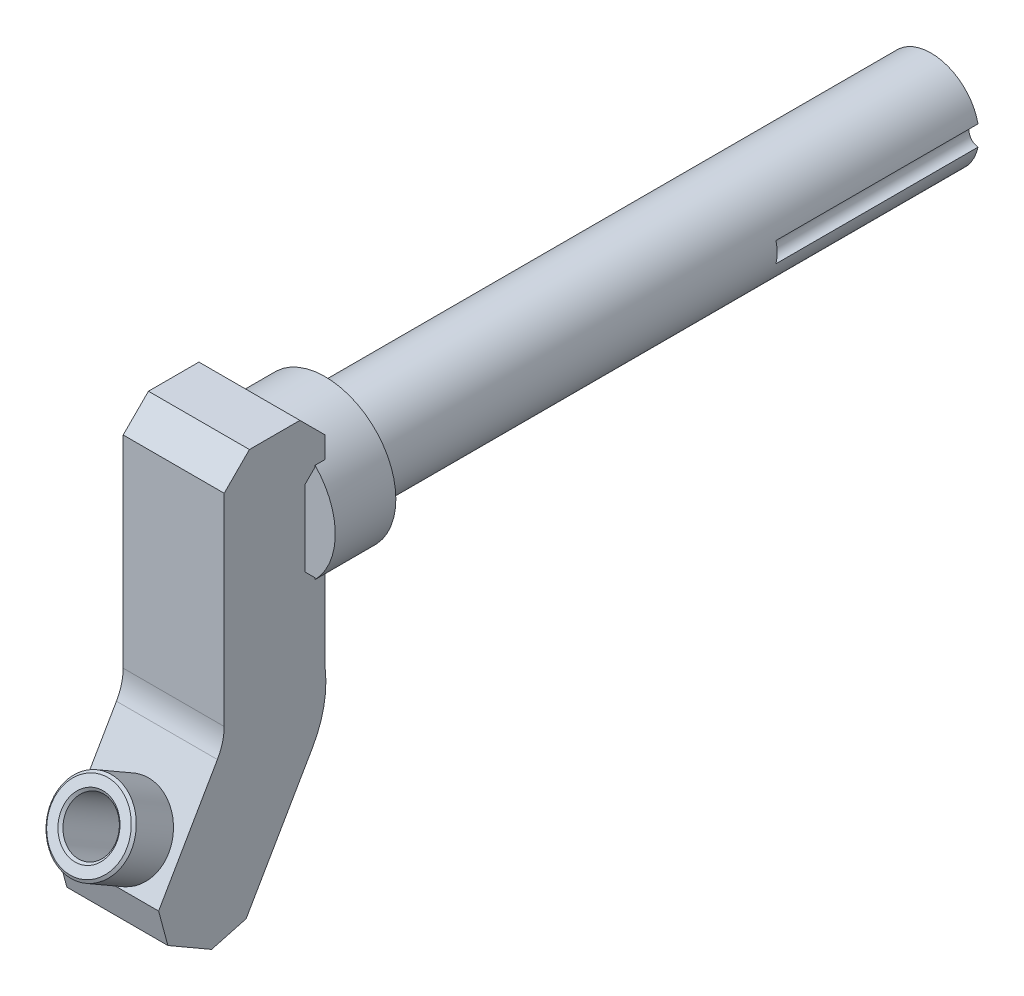
ISO-10303-21;
HEADER;
FILE_DESCRIPTION(('STEP AP214'),'2;1');
FILE_NAME('part.step','',(''),(''),'','','');
FILE_SCHEMA(('AUTOMOTIVE_DESIGN { 1 0 10303 214 1 1 1 1 }'));
ENDSEC;
DATA;
#1=APPLICATION_CONTEXT('core data for automotive mechanical design processes');
#2=APPLICATION_PROTOCOL_DEFINITION('international standard','automotive_design',2000,#1);
#3=PRODUCT_CONTEXT('',#1,'mechanical');
#4=PRODUCT('Part','Part','',(#3));
#5=PRODUCT_RELATED_PRODUCT_CATEGORY('part','',(#4));
#6=PRODUCT_DEFINITION_FORMATION('','',#4);
#7=PRODUCT_DEFINITION_CONTEXT('part definition',#1,'design');
#8=PRODUCT_DEFINITION('design','',#6,#7);
#9=PRODUCT_DEFINITION_SHAPE('','',#8);
#10=(LENGTH_UNIT() NAMED_UNIT(*) SI_UNIT(.MILLI.,.METRE.));
#11=(NAMED_UNIT(*) PLANE_ANGLE_UNIT() SI_UNIT($,.RADIAN.));
#12=(NAMED_UNIT(*) SI_UNIT($,.STERADIAN.) SOLID_ANGLE_UNIT());
#13=UNCERTAINTY_MEASURE_WITH_UNIT(LENGTH_MEASURE(1.E-05),#10,'distance_accuracy_value','');
#14=(GEOMETRIC_REPRESENTATION_CONTEXT(3) GLOBAL_UNCERTAINTY_ASSIGNED_CONTEXT((#13)) GLOBAL_UNIT_ASSIGNED_CONTEXT((#10,
#11,#12)) REPRESENTATION_CONTEXT('',''));
#15=CARTESIAN_POINT('',(0.,0.,0.));
#16=DIRECTION('',(0.,0.,1.));
#17=DIRECTION('',(1.,0.,0.));
#18=AXIS2_PLACEMENT_3D('',#15,#16,#17);
#19=CARTESIAN_POINT('',(10.,19.,130.));
#20=DIRECTION('',(0.,0.,1.));
#21=DIRECTION('',(1.,0.,0.));
#22=AXIS2_PLACEMENT_3D('',#19,#20,#21);
#23=PLANE('',#22);
#24=DIRECTION('',(0.,1.,0.));
#25=VECTOR('',#24,1.);
#26=CARTESIAN_POINT('',(-10.,19.,130.));
#27=LINE('',#26,#25);
#28=CARTESIAN_POINT('',(-10.,9.79795897113271,130.));
#29=VERTEX_POINT('',#28);
#30=CARTESIAN_POINT('',(-10.,14.,130.));
#31=VERTEX_POINT('',#30);
#32=EDGE_CURVE('E265',#29,#31,#27,.T.);
#33=ORIENTED_EDGE('',*,*,#32,.T.);
#34=DIRECTION('',(1.,0.,0.));
#35=VECTOR('',#34,1.);
#36=CARTESIAN_POINT('',(10.,14.,130.));
#37=LINE('',#36,#35);
#38=CARTESIAN_POINT('',(0.,14.,130.));
#39=VERTEX_POINT('',#38);
#40=EDGE_CURVE('E357',#31,#39,#37,.T.);
#41=ORIENTED_EDGE('',*,*,#40,.T.);
#42=CARTESIAN_POINT('',(0.,0.,130.));
#43=DIRECTION('',(0.,0.,1.));
#44=DIRECTION('',(1.,0.,0.));
#45=AXIS2_PLACEMENT_3D('',#42,#43,#44);
#46=CIRCLE('',#45,14.);
#47=EDGE_CURVE('E319',#39,#29,#46,.T.);
#48=ORIENTED_EDGE('',*,*,#47,.T.);
#49=EDGE_LOOP('',(#33,#41,#48));
#50=FACE_BOUND('',#49,.T.);
#51=ADVANCED_FACE('F42',(#50),#23,.F.);
#52=CARTESIAN_POINT('',(0.,0.,120.));
#53=DIRECTION('',(0.,0.,-1.));
#54=DIRECTION('',(-1.,0.,0.));
#55=AXIS2_PLACEMENT_3D('',#52,#53,#54);
#56=CYLINDRICAL_SURFACE('',#55,9.5);
#57=CARTESIAN_POINT('',(0.,0.,0.));
#58=DIRECTION('',(0.,0.,1.));
#59=DIRECTION('',(1.,0.,0.));
#60=AXIS2_PLACEMENT_3D('',#57,#58,#59);
#61=CIRCLE('',#60,9.5);
#62=CARTESIAN_POINT('',(9.28947368421052,1.98888880291486,0.));
#63=VERTEX_POINT('',#62);
#64=CARTESIAN_POINT('',(9.28947368421052,-1.98888880291486,0.));
#65=VERTEX_POINT('',#64);
#66=EDGE_CURVE('E214',#63,#65,#61,.T.);
#67=ORIENTED_EDGE('',*,*,#66,.T.);
#68=DIRECTION('',(0.,0.,-1.));
#69=VECTOR('',#68,1.);
#70=CARTESIAN_POINT('',(9.28947368421053,-1.98888880291486,40.));
#71=LINE('',#70,#69);
#72=CARTESIAN_POINT('',(9.28947368421053,-1.98888880291486,40.));
#73=VERTEX_POINT('',#72);
#74=EDGE_CURVE('E58',#73,#65,#71,.T.);
#75=ORIENTED_EDGE('',*,*,#74,.F.);
#76=CARTESIAN_POINT('',(0.,0.,40.));
#77=DIRECTION('',(0.,0.,-1.));
#78=DIRECTION('',(-1.,0.,0.));
#79=AXIS2_PLACEMENT_3D('',#76,#77,#78);
#80=CIRCLE('',#79,9.5);
#81=CARTESIAN_POINT('',(9.28947368421052,1.98888880291486,40.));
#82=VERTEX_POINT('',#81);
#83=EDGE_CURVE('E200',#82,#73,#80,.T.);
#84=ORIENTED_EDGE('',*,*,#83,.F.);
#85=DIRECTION('',(0.,0.,-1.));
#86=VECTOR('',#85,1.);
#87=CARTESIAN_POINT('',(9.28947368421052,1.98888880291486,40.));
#88=LINE('',#87,#86);
#89=EDGE_CURVE('E208',#82,#63,#88,.T.);
#90=ORIENTED_EDGE('',*,*,#89,.T.);
#91=EDGE_LOOP('',(#67,#75,#84,#90));
#92=FACE_BOUND('',#91,.T.);
#93=CARTESIAN_POINT('',(0.,0.,120.));
#94=DIRECTION('',(0.,0.,1.));
#95=DIRECTION('',(1.,0.,0.));
#96=AXIS2_PLACEMENT_3D('',#93,#94,#95);
#97=CIRCLE('',#96,9.5);
#98=CARTESIAN_POINT('',(9.5,0.,120.));
#99=VERTEX_POINT('',#98);
#100=EDGE_CURVE('E298',#99,#99,#97,.T.);
#101=ORIENTED_EDGE('',*,*,#100,.F.);
#102=EDGE_LOOP('',(#101));
#103=FACE_BOUND('',#102,.T.);
#104=ADVANCED_FACE('F211',(#92,#103),#56,.T.);
#105=CARTESIAN_POINT('',(0.,0.,0.));
#106=DIRECTION('',(0.,0.,1.));
#107=DIRECTION('',(1.,0.,0.));
#108=AXIS2_PLACEMENT_3D('',#105,#106,#107);
#109=PLANE('',#108);
#110=ORIENTED_EDGE('',*,*,#66,.F.);
#111=CARTESIAN_POINT('',(9.5,0.,0.));
#112=DIRECTION('',(0.,0.,-1.));
#113=DIRECTION('',(-1.,0.,0.));
#114=AXIS2_PLACEMENT_3D('',#111,#112,#113);
#115=CIRCLE('',#114,2.);
#116=EDGE_CURVE('E205',#65,#63,#115,.T.);
#117=ORIENTED_EDGE('',*,*,#116,.F.);
#118=EDGE_LOOP('',(#110,#117));
#119=FACE_BOUND('',#118,.T.);
#120=ADVANCED_FACE('F504',(#119),#109,.F.);
#121=CARTESIAN_POINT('',(0.,0.,132.));
#122=DIRECTION('',(0.,0.,-1.));
#123=DIRECTION('',(-1.,0.,0.));
#124=AXIS2_PLACEMENT_3D('',#121,#122,#123);
#125=CYLINDRICAL_SURFACE('',#124,14.);
#126=CARTESIAN_POINT('',(0.,0.,132.));
#127=DIRECTION('',(0.,0.,1.));
#128=DIRECTION('',(1.,0.,0.));
#129=AXIS2_PLACEMENT_3D('',#126,#127,#128);
#130=CIRCLE('',#129,14.);
#131=CARTESIAN_POINT('',(10.,-9.79795897113271,132.));
#132=VERTEX_POINT('',#131);
#133=CARTESIAN_POINT('',(10.,9.79795897113271,132.));
#134=VERTEX_POINT('',#133);
#135=EDGE_CURVE('E292',#132,#134,#130,.T.);
#136=ORIENTED_EDGE('',*,*,#135,.F.);
#137=DIRECTION('',(0.,0.,-1.));
#138=VECTOR('',#137,1.);
#139=CARTESIAN_POINT('',(10.,-9.79795897113271,132.));
#140=LINE('',#139,#138);
#141=CARTESIAN_POINT('',(10.,-9.79795897113271,130.));
#142=VERTEX_POINT('',#141);
#143=EDGE_CURVE('E288',#132,#142,#140,.T.);
#144=ORIENTED_EDGE('',*,*,#143,.T.);
#145=CARTESIAN_POINT('',(0.,0.,130.));
#146=DIRECTION('',(0.,0.,1.));
#147=DIRECTION('',(1.,0.,0.));
#148=AXIS2_PLACEMENT_3D('',#145,#146,#147);
#149=CIRCLE('',#148,14.);
#150=CARTESIAN_POINT('',(-10.,-9.79795897113271,130.));
#151=VERTEX_POINT('',#150);
#152=EDGE_CURVE('E318',#151,#142,#149,.T.);
#153=ORIENTED_EDGE('',*,*,#152,.F.);
#154=DIRECTION('',(0.,0.,-1.));
#155=VECTOR('',#154,1.);
#156=CARTESIAN_POINT('',(-10.,-9.79795897113271,132.));
#157=LINE('',#156,#155);
#158=CARTESIAN_POINT('',(-10.,-9.79795897113271,132.));
#159=VERTEX_POINT('',#158);
#160=EDGE_CURVE('E283',#159,#151,#157,.T.);
#161=ORIENTED_EDGE('',*,*,#160,.F.);
#162=CARTESIAN_POINT('',(-10.,9.79795897113271,132.));
#163=VERTEX_POINT('',#162);
#164=EDGE_CURVE('E295',#163,#159,#130,.T.);
#165=ORIENTED_EDGE('',*,*,#164,.F.);
#166=DIRECTION('',(0.,0.,-1.));
#167=VECTOR('',#166,1.);
#168=CARTESIAN_POINT('',(-10.,9.79795897113271,132.));
#169=LINE('',#168,#167);
#170=EDGE_CURVE('E281',#29,#163,#169,.F.);
#171=ORIENTED_EDGE('',*,*,#170,.F.);
#172=ORIENTED_EDGE('',*,*,#47,.F.);
#173=CARTESIAN_POINT('',(10.,9.79795897113271,130.));
#174=VERTEX_POINT('',#173);
#175=EDGE_CURVE('E315',#174,#39,#46,.T.);
#176=ORIENTED_EDGE('',*,*,#175,.F.);
#177=DIRECTION('',(0.,0.,-1.));
#178=VECTOR('',#177,1.);
#179=CARTESIAN_POINT('',(10.,9.79795897113271,132.));
#180=LINE('',#179,#178);
#181=EDGE_CURVE('E285',#174,#134,#180,.F.);
#182=ORIENTED_EDGE('',*,*,#181,.T.);
#183=EDGE_LOOP('',(#136,#144,#153,#161,#165,#171,#172,#176,#182));
#184=FACE_BOUND('',#183,.T.);
#185=CARTESIAN_POINT('',(0.,0.,120.));
#186=DIRECTION('',(0.,0.,1.));
#187=DIRECTION('',(1.,0.,0.));
#188=AXIS2_PLACEMENT_3D('',#185,#186,#187);
#189=CIRCLE('',#188,14.);
#190=CARTESIAN_POINT('',(14.,0.,120.));
#191=VERTEX_POINT('',#190);
#192=EDGE_CURVE('E291',#191,#191,#189,.T.);
#193=ORIENTED_EDGE('',*,*,#192,.T.);
#194=EDGE_LOOP('',(#193));
#195=FACE_BOUND('',#194,.T.);
#196=ADVANCED_FACE('F407',(#184,#195),#125,.T.);
#197=CARTESIAN_POINT('',(0.,0.,132.));
#198=DIRECTION('',(0.,0.,1.));
#199=DIRECTION('',(1.,0.,0.));
#200=AXIS2_PLACEMENT_3D('',#197,#198,#199);
#201=PLANE('',#200);
#202=DIRECTION('',(0.,1.,0.));
#203=VECTOR('',#202,1.);
#204=CARTESIAN_POINT('',(10.,0.,132.));
#205=LINE('',#204,#203);
#206=CARTESIAN_POINT('',(10.,-9.5,132.));
#207=VERTEX_POINT('',#206);
#208=EDGE_CURVE('E311',#132,#207,#205,.T.);
#209=ORIENTED_EDGE('',*,*,#208,.F.);
#210=ORIENTED_EDGE('',*,*,#135,.T.);
#211=CARTESIAN_POINT('',(10.,9.5,132.));
#212=VERTEX_POINT('',#211);
#213=EDGE_CURVE('E309',#212,#134,#205,.T.);
#214=ORIENTED_EDGE('',*,*,#213,.F.);
#215=DIRECTION('',(-1.,0.,0.));
#216=VECTOR('',#215,1.);
#217=CARTESIAN_POINT('',(0.,9.5,132.));
#218=LINE('',#217,#216);
#219=CARTESIAN_POINT('',(-10.,9.5,132.));
#220=VERTEX_POINT('',#219);
#221=EDGE_CURVE('E305',#212,#220,#218,.T.);
#222=ORIENTED_EDGE('',*,*,#221,.T.);
#223=DIRECTION('',(0.,1.,0.));
#224=VECTOR('',#223,1.);
#225=CARTESIAN_POINT('',(-10.,0.,132.));
#226=LINE('',#225,#224);
#227=EDGE_CURVE('E301',#220,#163,#226,.T.);
#228=ORIENTED_EDGE('',*,*,#227,.T.);
#229=ORIENTED_EDGE('',*,*,#164,.T.);
#230=CARTESIAN_POINT('',(-10.,-9.5,132.));
#231=VERTEX_POINT('',#230);
#232=EDGE_CURVE('E306',#159,#231,#226,.T.);
#233=ORIENTED_EDGE('',*,*,#232,.T.);
#234=DIRECTION('',(1.,0.,0.));
#235=VECTOR('',#234,1.);
#236=CARTESIAN_POINT('',(0.,-9.5,132.));
#237=LINE('',#236,#235);
#238=EDGE_CURVE('E312',#231,#207,#237,.T.);
#239=ORIENTED_EDGE('',*,*,#238,.T.);
#240=EDGE_LOOP('',(#209,#210,#214,#222,#228,#229,#233,#239));
#241=FACE_BOUND('',#240,.T.);
#242=ADVANCED_FACE('F404',(#241),#201,.T.);
#243=CARTESIAN_POINT('',(0.,0.,120.));
#244=DIRECTION('',(0.,0.,1.));
#245=DIRECTION('',(1.,0.,0.));
#246=AXIS2_PLACEMENT_3D('',#243,#244,#245);
#247=PLANE('',#246);
#248=ORIENTED_EDGE('',*,*,#100,.T.);
#249=EDGE_LOOP('',(#248));
#250=FACE_BOUND('',#249,.T.);
#251=ORIENTED_EDGE('',*,*,#192,.F.);
#252=EDGE_LOOP('',(#251));
#253=FACE_BOUND('',#252,.T.);
#254=ADVANCED_FACE('F531',(#250,#253),#247,.F.);
#255=CARTESIAN_POINT('',(10.,-26.,160.));
#256=DIRECTION('',(1.,0.,0.));
#257=DIRECTION('',(0.,0.,-1.));
#258=AXIS2_PLACEMENT_3D('',#255,#256,#257);
#259=PLANE('',#258);
#260=DIRECTION('',(0.,1.,0.));
#261=VECTOR('',#260,1.);
#262=CARTESIAN_POINT('',(10.,19.,130.));
#263=LINE('',#262,#261);
#264=CARTESIAN_POINT('',(10.,14.,130.));
#265=VERTEX_POINT('',#264);
#266=EDGE_CURVE('E240',#174,#265,#263,.T.);
#267=ORIENTED_EDGE('',*,*,#266,.T.);
#268=DIRECTION('',(0.,-0.707106781186549,-0.707106781186546));
#269=VECTOR('',#268,1.);
#270=CARTESIAN_POINT('',(10.,8.99999999999989,125.));
#271=LINE('',#270,#269);
#272=CARTESIAN_POINT('',(10.,19.,135.));
#273=VERTEX_POINT('',#272);
#274=EDGE_CURVE('E365',#265,#273,#271,.F.);
#275=ORIENTED_EDGE('',*,*,#274,.T.);
#276=DIRECTION('',(0.,0.,1.));
#277=VECTOR('',#276,1.);
#278=CARTESIAN_POINT('',(10.,19.,150.));
#279=LINE('',#278,#277);
#280=CARTESIAN_POINT('',(10.,19.,145.));
#281=VERTEX_POINT('',#280);
#282=EDGE_CURVE('E243',#273,#281,#279,.T.);
#283=ORIENTED_EDGE('',*,*,#282,.T.);
#284=DIRECTION('',(0.,0.707106781186546,-0.707106781186549));
#285=VECTOR('',#284,1.);
#286=CARTESIAN_POINT('',(10.,-10.9999999999999,175.));
#287=LINE('',#286,#285);
#288=CARTESIAN_POINT('',(10.,14.,150.));
#289=VERTEX_POINT('',#288);
#290=EDGE_CURVE('E363',#281,#289,#287,.F.);
#291=ORIENTED_EDGE('',*,*,#290,.T.);
#292=DIRECTION('',(0.,-1.,0.));
#293=VECTOR('',#292,1.);
#294=CARTESIAN_POINT('',(10.,19.,150.));
#295=LINE('',#294,#293);
#296=CARTESIAN_POINT('',(10.,-26.,150.));
#297=VERTEX_POINT('',#296);
#298=EDGE_CURVE('E220',#289,#297,#295,.T.);
#299=ORIENTED_EDGE('',*,*,#298,.T.);
#300=CARTESIAN_POINT('',(10.,-26.,160.));
#301=DIRECTION('',(-1.,0.,0.));
#302=DIRECTION('',(0.,0.,-1.));
#303=AXIS2_PLACEMENT_3D('',#300,#301,#302);
#304=CIRCLE('',#303,10.);
#305=CARTESIAN_POINT('',(10.,-31.,151.339745962156));
#306=VERTEX_POINT('',#305);
#307=EDGE_CURVE('E222',#297,#306,#304,.T.);
#308=ORIENTED_EDGE('',*,*,#307,.T.);
#309=DIRECTION('',(0.,-0.866025403784442,0.499999999999995));
#310=VECTOR('',#309,1.);
#311=CARTESIAN_POINT('',(10.,-55.4940905122491,165.481415712957));
#312=LINE('',#311,#310);
#313=CARTESIAN_POINT('',(10.,-51.1639634933269,162.981415712958));
#314=VERTEX_POINT('',#313);
#315=EDGE_CURVE('E225',#306,#314,#312,.T.);
#316=ORIENTED_EDGE('',*,*,#315,.T.);
#317=DIRECTION('',(0.,0.965925826289066,0.258819045102529));
#318=VECTOR('',#317,1.);
#319=CARTESIAN_POINT('',(10.,-28.4310198523403,169.072689603142));
#320=LINE('',#319,#318);
#321=CARTESIAN_POINT('',(10.,-57.994090512249,161.151288694035));
#322=VERTEX_POINT('',#321);
#323=EDGE_CURVE('E359',#314,#322,#320,.F.);
#324=ORIENTED_EDGE('',*,*,#323,.T.);
#325=DIRECTION('',(0.,-0.499999999999994,-0.866025403784442));
#326=VECTOR('',#325,1.);
#327=CARTESIAN_POINT('',(10.,-55.4940905122491,165.481415712957));
#328=LINE('',#327,#326);
#329=CARTESIAN_POINT('',(10.,-62.994090512249,152.491034656191));
#330=VERTEX_POINT('',#329);
#331=EDGE_CURVE('E228',#322,#330,#328,.T.);
#332=ORIENTED_EDGE('',*,*,#331,.T.);
#333=DIRECTION('',(0.,-0.258819045102525,0.965925826289067));
#334=VECTOR('',#333,1.);
#335=CARTESIAN_POINT('',(10.,-62.3931976788309,150.248472071971));
#336=LINE('',#335,#334);
#337=CARTESIAN_POINT('',(10.,-61.1639634933267,145.660907637269));
#338=VERTEX_POINT('',#337);
#339=EDGE_CURVE('E361',#330,#338,#336,.F.);
#340=ORIENTED_EDGE('',*,*,#339,.T.);
#341=DIRECTION('',(0.,0.866025403784442,-0.499999999999994));
#342=VECTOR('',#341,1.);
#343=CARTESIAN_POINT('',(10.,-65.494090512249,148.160907637269));
#344=LINE('',#343,#342);
#345=CARTESIAN_POINT('',(10.,-38.4241007691811,132.532041772148));
#346=VERTEX_POINT('',#345);
#347=EDGE_CURVE('E231',#338,#346,#344,.T.);
#348=ORIENTED_EDGE('',*,*,#347,.T.);
#349=CARTESIAN_POINT('',(10.,-28.4241007691812,149.852549847837));
#350=DIRECTION('',(1.,0.,0.));
#351=DIRECTION('',(0.,0.,-1.));
#352=AXIS2_PLACEMENT_3D('',#349,#350,#351);
#353=CIRCLE('',#352,20.);
#354=CARTESIAN_POINT('',(10.,-26.,130.));
#355=VERTEX_POINT('',#354);
#356=EDGE_CURVE('E233',#346,#355,#353,.T.);
#357=ORIENTED_EDGE('',*,*,#356,.T.);
#358=DIRECTION('',(0.,1.,0.));
#359=VECTOR('',#358,1.);
#360=CARTESIAN_POINT('',(10.,-9.5,130.));
#361=LINE('',#360,#359);
#362=EDGE_CURVE('E235',#355,#142,#361,.T.);
#363=ORIENTED_EDGE('',*,*,#362,.T.);
#364=ORIENTED_EDGE('',*,*,#143,.F.);
#365=ORIENTED_EDGE('',*,*,#208,.T.);
#366=DIRECTION('',(0.,-0.707106781186547,-0.707106781186548));
#367=VECTOR('',#366,1.);
#368=CARTESIAN_POINT('',(10.,-7.5,134.));
#369=LINE('',#368,#367);
#370=CARTESIAN_POINT('',(10.,-7.5,134.));
#371=VERTEX_POINT('',#370);
#372=EDGE_CURVE('E388',#207,#371,#369,.F.);
#373=ORIENTED_EDGE('',*,*,#372,.T.);
#374=DIRECTION('',(0.,1.,0.));
#375=VECTOR('',#374,1.);
#376=CARTESIAN_POINT('',(10.,9.5,134.));
#377=LINE('',#376,#375);
#378=CARTESIAN_POINT('',(10.,7.49999999999997,134.));
#379=VERTEX_POINT('',#378);
#380=EDGE_CURVE('E238',#371,#379,#377,.T.);
#381=ORIENTED_EDGE('',*,*,#380,.T.);
#382=DIRECTION('',(0.,-0.707106781186548,0.707106781186548));
#383=VECTOR('',#382,1.);
#384=CARTESIAN_POINT('',(10.,9.5,132.));
#385=LINE('',#384,#383);
#386=EDGE_CURVE('E11',#379,#212,#385,.F.);
#387=ORIENTED_EDGE('',*,*,#386,.T.);
#388=ORIENTED_EDGE('',*,*,#213,.T.);
#389=ORIENTED_EDGE('',*,*,#181,.F.);
#390=EDGE_LOOP('',(#267,#275,#283,#291,#299,#308,#316,#324,#332,#340,#348,#357,#363,#364,#365,
#373,#381,#387,#388,#389));
#391=FACE_BOUND('',#390,.T.);
#392=ADVANCED_FACE('F401',(#391),#259,.T.);
#393=CARTESIAN_POINT('',(-10.,-26.,160.));
#394=DIRECTION('',(1.,0.,0.));
#395=DIRECTION('',(0.,0.,-1.));
#396=AXIS2_PLACEMENT_3D('',#393,#394,#395);
#397=PLANE('',#396);
#398=DIRECTION('',(0.,0.,1.));
#399=VECTOR('',#398,1.);
#400=CARTESIAN_POINT('',(-10.,19.,150.));
#401=LINE('',#400,#399);
#402=CARTESIAN_POINT('',(-10.,19.,135.));
#403=VERTEX_POINT('',#402);
#404=CARTESIAN_POINT('',(-10.,19.,145.));
#405=VERTEX_POINT('',#404);
#406=EDGE_CURVE('E223',#403,#405,#401,.T.);
#407=ORIENTED_EDGE('',*,*,#406,.F.);
#408=DIRECTION('',(0.,0.707106781186549,0.707106781186546));
#409=VECTOR('',#408,1.);
#410=CARTESIAN_POINT('',(-10.,19.,135.));
#411=LINE('',#410,#409);
#412=EDGE_CURVE('E353',#403,#31,#411,.F.);
#413=ORIENTED_EDGE('',*,*,#412,.T.);
#414=ORIENTED_EDGE('',*,*,#32,.F.);
#415=ORIENTED_EDGE('',*,*,#170,.T.);
#416=ORIENTED_EDGE('',*,*,#227,.F.);
#417=DIRECTION('',(0.,0.707106781186548,-0.707106781186548));
#418=VECTOR('',#417,1.);
#419=CARTESIAN_POINT('',(-10.,-22.25,163.75));
#420=LINE('',#419,#418);
#421=CARTESIAN_POINT('',(-10.,7.49999999999997,134.));
#422=VERTEX_POINT('',#421);
#423=EDGE_CURVE('E51',#220,#422,#420,.F.);
#424=ORIENTED_EDGE('',*,*,#423,.T.);
#425=DIRECTION('',(0.,1.,0.));
#426=VECTOR('',#425,1.);
#427=CARTESIAN_POINT('',(-10.,9.5,134.));
#428=LINE('',#427,#426);
#429=CARTESIAN_POINT('',(-10.,-7.5,134.));
#430=VERTEX_POINT('',#429);
#431=EDGE_CURVE('E263',#430,#422,#428,.T.);
#432=ORIENTED_EDGE('',*,*,#431,.F.);
#433=DIRECTION('',(0.,0.707106781186547,0.707106781186548));
#434=VECTOR('',#433,1.);
#435=CARTESIAN_POINT('',(-10.,-3.74999999999998,137.75));
#436=LINE('',#435,#434);
#437=EDGE_CURVE('E386',#430,#231,#436,.F.);
#438=ORIENTED_EDGE('',*,*,#437,.T.);
#439=ORIENTED_EDGE('',*,*,#232,.F.);
#440=ORIENTED_EDGE('',*,*,#160,.T.);
#441=DIRECTION('',(0.,1.,0.));
#442=VECTOR('',#441,1.);
#443=CARTESIAN_POINT('',(-10.,-9.5,130.));
#444=LINE('',#443,#442);
#445=CARTESIAN_POINT('',(-10.,-26.,130.));
#446=VERTEX_POINT('',#445);
#447=EDGE_CURVE('E260',#446,#151,#444,.T.);
#448=ORIENTED_EDGE('',*,*,#447,.F.);
#449=CARTESIAN_POINT('',(-10.,-28.4241007691812,149.852549847837));
#450=DIRECTION('',(1.,0.,0.));
#451=DIRECTION('',(0.,0.,-1.));
#452=AXIS2_PLACEMENT_3D('',#449,#450,#451);
#453=CIRCLE('',#452,20.);
#454=CARTESIAN_POINT('',(-10.,-38.4241007691811,132.532041772148));
#455=VERTEX_POINT('',#454);
#456=EDGE_CURVE('E258',#455,#446,#453,.T.);
#457=ORIENTED_EDGE('',*,*,#456,.F.);
#458=DIRECTION('',(0.,0.866025403784442,-0.499999999999994));
#459=VECTOR('',#458,1.);
#460=CARTESIAN_POINT('',(-10.,-65.494090512249,148.160907637269));
#461=LINE('',#460,#459);
#462=CARTESIAN_POINT('',(-10.,-61.1639634933267,145.660907637269));
#463=VERTEX_POINT('',#462);
#464=EDGE_CURVE('E256',#463,#455,#461,.T.);
#465=ORIENTED_EDGE('',*,*,#464,.F.);
#466=DIRECTION('',(0.,0.258819045102525,-0.965925826289067));
#467=VECTOR('',#466,1.);
#468=CARTESIAN_POINT('',(-10.,-61.1639634933267,145.660907637269));
#469=LINE('',#468,#467);
#470=CARTESIAN_POINT('',(-10.,-62.994090512249,152.491034656191));
#471=VERTEX_POINT('',#470);
#472=EDGE_CURVE('E349',#463,#471,#469,.F.);
#473=ORIENTED_EDGE('',*,*,#472,.T.);
#474=DIRECTION('',(0.,-0.499999999999994,-0.866025403784442));
#475=VECTOR('',#474,1.);
#476=CARTESIAN_POINT('',(-10.,-55.4940905122491,165.481415712957));
#477=LINE('',#476,#475);
#478=CARTESIAN_POINT('',(-10.,-57.994090512249,161.151288694035));
#479=VERTEX_POINT('',#478);
#480=EDGE_CURVE('E253',#479,#471,#477,.T.);
#481=ORIENTED_EDGE('',*,*,#480,.F.);
#482=DIRECTION('',(0.,-0.965925826289066,-0.258819045102529));
#483=VECTOR('',#482,1.);
#484=CARTESIAN_POINT('',(-10.,-57.994090512249,161.151288694035));
#485=LINE('',#484,#483);
#486=CARTESIAN_POINT('',(-10.,-51.1639634933269,162.981415712958));
#487=VERTEX_POINT('',#486);
#488=EDGE_CURVE('E347',#479,#487,#485,.F.);
#489=ORIENTED_EDGE('',*,*,#488,.T.);
#490=DIRECTION('',(0.,-0.866025403784442,0.499999999999995));
#491=VECTOR('',#490,1.);
#492=CARTESIAN_POINT('',(-10.,-55.4940905122491,165.481415712957));
#493=LINE('',#492,#491);
#494=CARTESIAN_POINT('',(-10.,-31.,151.339745962156));
#495=VERTEX_POINT('',#494);
#496=EDGE_CURVE('E250',#495,#487,#493,.T.);
#497=ORIENTED_EDGE('',*,*,#496,.F.);
#498=CARTESIAN_POINT('',(-10.,-26.,160.));
#499=DIRECTION('',(-1.,0.,0.));
#500=DIRECTION('',(0.,0.,-1.));
#501=AXIS2_PLACEMENT_3D('',#498,#499,#500);
#502=CIRCLE('',#501,10.);
#503=CARTESIAN_POINT('',(-10.,-26.,150.));
#504=VERTEX_POINT('',#503);
#505=EDGE_CURVE('E248',#504,#495,#502,.T.);
#506=ORIENTED_EDGE('',*,*,#505,.F.);
#507=DIRECTION('',(0.,-1.,0.));
#508=VECTOR('',#507,1.);
#509=CARTESIAN_POINT('',(-10.,19.,150.));
#510=LINE('',#509,#508);
#511=CARTESIAN_POINT('',(-10.,14.,150.));
#512=VERTEX_POINT('',#511);
#513=EDGE_CURVE('E216',#512,#504,#510,.T.);
#514=ORIENTED_EDGE('',*,*,#513,.F.);
#515=DIRECTION('',(0.,-0.707106781186546,0.707106781186549));
#516=VECTOR('',#515,1.);
#517=CARTESIAN_POINT('',(-10.,14.,150.));
#518=LINE('',#517,#516);
#519=EDGE_CURVE('E351',#512,#405,#518,.F.);
#520=ORIENTED_EDGE('',*,*,#519,.T.);
#521=EDGE_LOOP('',(#407,#413,#414,#415,#416,#424,#432,#438,#439,#440,#448,#457,#465,#473,#481,
#489,#497,#506,#514,#520));
#522=FACE_BOUND('',#521,.T.);
#523=ADVANCED_FACE('F393',(#522),#397,.F.);
#524=CARTESIAN_POINT('',(10.,19.,150.));
#525=DIRECTION('',(0.,0.,-1.));
#526=DIRECTION('',(-1.,0.,0.));
#527=AXIS2_PLACEMENT_3D('',#524,#525,#526);
#528=PLANE('',#527);
#529=ORIENTED_EDGE('',*,*,#298,.F.);
#530=DIRECTION('',(-1.,0.,0.));
#531=VECTOR('',#530,1.);
#532=CARTESIAN_POINT('',(10.,14.,150.));
#533=LINE('',#532,#531);
#534=EDGE_CURVE('E367',#289,#512,#533,.T.);
#535=ORIENTED_EDGE('',*,*,#534,.T.);
#536=ORIENTED_EDGE('',*,*,#513,.T.);
#537=DIRECTION('',(-1.,0.,0.));
#538=VECTOR('',#537,1.);
#539=CARTESIAN_POINT('',(10.,-26.,150.));
#540=LINE('',#539,#538);
#541=EDGE_CURVE('E278',#297,#504,#540,.T.);
#542=ORIENTED_EDGE('',*,*,#541,.F.);
#543=EDGE_LOOP('',(#529,#535,#536,#542));
#544=FACE_BOUND('',#543,.T.);
#545=ADVANCED_FACE('F433',(#544),#528,.F.);
#546=CARTESIAN_POINT('',(10.,-26.,160.));
#547=DIRECTION('',(-1.,0.,0.));
#548=DIRECTION('',(0.,0.,1.));
#549=AXIS2_PLACEMENT_3D('',#546,#547,#548);
#550=CYLINDRICAL_SURFACE('',#549,10.);
#551=ORIENTED_EDGE('',*,*,#505,.T.);
#552=DIRECTION('',(-1.,0.,0.));
#553=VECTOR('',#552,1.);
#554=CARTESIAN_POINT('',(10.,-31.,151.339745962156));
#555=LINE('',#554,#553);
#556=EDGE_CURVE('E275',#306,#495,#555,.T.);
#557=ORIENTED_EDGE('',*,*,#556,.F.);
#558=ORIENTED_EDGE('',*,*,#307,.F.);
#559=ORIENTED_EDGE('',*,*,#541,.T.);
#560=EDGE_LOOP('',(#551,#557,#558,#559));
#561=FACE_BOUND('',#560,.T.);
#562=ADVANCED_FACE('F437',(#561),#550,.F.);
#563=CARTESIAN_POINT('',(10.,-55.4940905122491,165.481415712957));
#564=DIRECTION('',(0.,-0.499999999999995,-0.866025403784442));
#565=DIRECTION('',(0.,0.866025403784442,-0.499999999999995));
#566=AXIS2_PLACEMENT_3D('',#563,#564,#565);
#567=PLANE('',#566);
#568=ORIENTED_EDGE('',*,*,#496,.T.);
#569=DIRECTION('',(1.,0.,0.));
#570=VECTOR('',#569,1.);
#571=CARTESIAN_POINT('',(10.,-51.1639634933269,162.981415712958));
#572=LINE('',#571,#570);
#573=CARTESIAN_POINT('',(0.,-51.1639634933269,162.981415712958));
#574=VERTEX_POINT('',#573);
#575=EDGE_CURVE('E380',#487,#574,#572,.T.);
#576=ORIENTED_EDGE('',*,*,#575,.T.);
#577=CARTESIAN_POINT('',(0.,-44.2357602630514,158.981415712958));
#578=DIRECTION('',(0.,-0.499999999999995,-0.866025403784442));
#579=DIRECTION('',(0.,0.866025403784442,-0.499999999999995));
#580=AXIS2_PLACEMENT_3D('',#577,#578,#579);
#581=CIRCLE('',#580,8.00000000000001);
#582=EDGE_CURVE('E321',#574,#574,#581,.F.);
#583=ORIENTED_EDGE('',*,*,#582,.F.);
#584=DIRECTION('',(1.,0.,0.));
#585=VECTOR('',#584,1.);
#586=CARTESIAN_POINT('',(10.,-51.1639634933269,162.981415712958));
#587=LINE('',#586,#585);
#588=EDGE_CURVE('E378',#574,#314,#587,.T.);
#589=ORIENTED_EDGE('',*,*,#588,.T.);
#590=ORIENTED_EDGE('',*,*,#315,.F.);
#591=ORIENTED_EDGE('',*,*,#556,.T.);
#592=EDGE_LOOP('',(#568,#576,#583,#589,#590,#591));
#593=FACE_BOUND('',#592,.T.);
#594=ADVANCED_FACE('F482',(#593),#567,.F.);
#595=CARTESIAN_POINT('',(10.,-55.4940905122491,165.481415712957));
#596=DIRECTION('',(0.,0.866025403784442,-0.499999999999994));
#597=DIRECTION('',(0.,0.499999999999994,0.866025403784442));
#598=AXIS2_PLACEMENT_3D('',#595,#596,#597);
#599=PLANE('',#598);
#600=ORIENTED_EDGE('',*,*,#480,.T.);
#601=DIRECTION('',(1.,0.,0.));
#602=VECTOR('',#601,1.);
#603=CARTESIAN_POINT('',(10.,-62.994090512249,152.491034656191));
#604=LINE('',#603,#602);
#605=EDGE_CURVE('E376',#471,#330,#604,.T.);
#606=ORIENTED_EDGE('',*,*,#605,.T.);
#607=ORIENTED_EDGE('',*,*,#331,.F.);
#608=DIRECTION('',(-1.,0.,0.));
#609=VECTOR('',#608,1.);
#610=CARTESIAN_POINT('',(10.,-57.994090512249,161.151288694035));
#611=LINE('',#610,#609);
#612=EDGE_CURVE('E373',#322,#479,#611,.T.);
#613=ORIENTED_EDGE('',*,*,#612,.T.);
#614=EDGE_LOOP('',(#600,#606,#607,#613));
#615=FACE_BOUND('',#614,.T.);
#616=ADVANCED_FACE('F450',(#615),#599,.F.);
#617=CARTESIAN_POINT('',(10.,-65.494090512249,148.160907637269));
#618=DIRECTION('',(0.,0.499999999999995,0.866025403784442));
#619=DIRECTION('',(0.,-0.866025403784442,0.499999999999995));
#620=AXIS2_PLACEMENT_3D('',#617,#618,#619);
#621=PLANE('',#620);
#622=CARTESIAN_POINT('',(0.,-54.2357602630512,141.660907637269));
#623=DIRECTION('',(0.,0.499999999999995,0.866025403784442));
#624=DIRECTION('',(0.,-0.866025403784442,0.499999999999995));
#625=AXIS2_PLACEMENT_3D('',#622,#623,#624);
#626=CIRCLE('',#625,5.49999999999987);
#627=CARTESIAN_POINT('',(0.,-58.9988999838656,144.410907637269));
#628=VERTEX_POINT('',#627);
#629=EDGE_CURVE('E324',#628,#628,#626,.T.);
#630=ORIENTED_EDGE('',*,*,#629,.T.);
#631=EDGE_LOOP('',(#630));
#632=FACE_BOUND('',#631,.T.);
#633=ORIENTED_EDGE('',*,*,#347,.F.);
#634=DIRECTION('',(-1.,0.,0.));
#635=VECTOR('',#634,1.);
#636=CARTESIAN_POINT('',(10.,-61.1639634933267,145.660907637269));
#637=LINE('',#636,#635);
#638=EDGE_CURVE('E370',#338,#463,#637,.T.);
#639=ORIENTED_EDGE('',*,*,#638,.T.);
#640=ORIENTED_EDGE('',*,*,#464,.T.);
#641=DIRECTION('',(-1.,0.,0.));
#642=VECTOR('',#641,1.);
#643=CARTESIAN_POINT('',(10.,-38.4241007691811,132.532041772148));
#644=LINE('',#643,#642);
#645=EDGE_CURVE('E272',#346,#455,#644,.T.);
#646=ORIENTED_EDGE('',*,*,#645,.F.);
#647=EDGE_LOOP('',(#633,#639,#640,#646));
#648=FACE_BOUND('',#647,.T.);
#649=ADVANCED_FACE('F461',(#632,#648),#621,.F.);
#650=CARTESIAN_POINT('',(10.,-28.4241007691812,149.852549847837));
#651=DIRECTION('',(-1.,0.,0.));
#652=DIRECTION('',(0.,0.,1.));
#653=AXIS2_PLACEMENT_3D('',#650,#651,#652);
#654=CYLINDRICAL_SURFACE('',#653,20.);
#655=ORIENTED_EDGE('',*,*,#456,.T.);
#656=DIRECTION('',(-1.,0.,0.));
#657=VECTOR('',#656,1.);
#658=CARTESIAN_POINT('',(10.,-26.,130.));
#659=LINE('',#658,#657);
#660=EDGE_CURVE('E246',#355,#446,#659,.T.);
#661=ORIENTED_EDGE('',*,*,#660,.F.);
#662=ORIENTED_EDGE('',*,*,#356,.F.);
#663=ORIENTED_EDGE('',*,*,#645,.T.);
#664=EDGE_LOOP('',(#655,#661,#662,#663));
#665=FACE_BOUND('',#664,.T.);
#666=ADVANCED_FACE('F467',(#665),#654,.T.);
#667=CARTESIAN_POINT('',(10.,-9.5,130.));
#668=DIRECTION('',(0.,0.,1.));
#669=DIRECTION('',(1.,0.,0.));
#670=AXIS2_PLACEMENT_3D('',#667,#668,#669);
#671=PLANE('',#670);
#672=ORIENTED_EDGE('',*,*,#447,.T.);
#673=ORIENTED_EDGE('',*,*,#152,.T.);
#674=ORIENTED_EDGE('',*,*,#362,.F.);
#675=ORIENTED_EDGE('',*,*,#660,.T.);
#676=EDGE_LOOP('',(#672,#673,#674,#675));
#677=FACE_BOUND('',#676,.T.);
#678=ADVANCED_FACE('F470',(#677),#671,.F.);
#679=CARTESIAN_POINT('',(10.,9.5,134.));
#680=DIRECTION('',(0.,0.,1.));
#681=DIRECTION('',(1.,0.,0.));
#682=AXIS2_PLACEMENT_3D('',#679,#680,#681);
#683=PLANE('',#682);
#684=ORIENTED_EDGE('',*,*,#380,.F.);
#685=DIRECTION('',(-1.,0.,0.));
#686=VECTOR('',#685,1.);
#687=CARTESIAN_POINT('',(-10.,-7.5,134.));
#688=LINE('',#687,#686);
#689=EDGE_CURVE('E383',#371,#430,#688,.T.);
#690=ORIENTED_EDGE('',*,*,#689,.T.);
#691=ORIENTED_EDGE('',*,*,#431,.T.);
#692=DIRECTION('',(1.,0.,0.));
#693=VECTOR('',#692,1.);
#694=CARTESIAN_POINT('',(10.,7.49999999999997,134.));
#695=LINE('',#694,#693);
#696=EDGE_CURVE('E66',#422,#379,#695,.T.);
#697=ORIENTED_EDGE('',*,*,#696,.T.);
#698=EDGE_LOOP('',(#684,#690,#691,#697));
#699=FACE_BOUND('',#698,.T.);
#700=ADVANCED_FACE('F396',(#699),#683,.F.);
#701=ORIENTED_EDGE('',*,*,#175,.T.);
#702=DIRECTION('',(1.,0.,0.));
#703=VECTOR('',#702,1.);
#704=CARTESIAN_POINT('',(10.,14.,130.));
#705=LINE('',#704,#703);
#706=EDGE_CURVE('E355',#39,#265,#705,.T.);
#707=ORIENTED_EDGE('',*,*,#706,.T.);
#708=ORIENTED_EDGE('',*,*,#266,.F.);
#709=EDGE_LOOP('',(#701,#707,#708));
#710=FACE_BOUND('',#709,.T.);
#711=ADVANCED_FACE('F415',(#710),#23,.F.);
#712=CARTESIAN_POINT('',(10.,19.,150.));
#713=DIRECTION('',(0.,-1.,0.));
#714=DIRECTION('',(0.,0.,-1.));
#715=AXIS2_PLACEMENT_3D('',#712,#713,#714);
#716=PLANE('',#715);
#717=ORIENTED_EDGE('',*,*,#282,.F.);
#718=DIRECTION('',(-1.,0.,0.));
#719=VECTOR('',#718,1.);
#720=CARTESIAN_POINT('',(10.,19.,135.));
#721=LINE('',#720,#719);
#722=EDGE_CURVE('E344',#273,#403,#721,.T.);
#723=ORIENTED_EDGE('',*,*,#722,.T.);
#724=ORIENTED_EDGE('',*,*,#406,.T.);
#725=DIRECTION('',(1.,0.,0.));
#726=VECTOR('',#725,1.);
#727=CARTESIAN_POINT('',(10.,19.,145.));
#728=LINE('',#727,#726);
#729=EDGE_CURVE('E342',#405,#281,#728,.T.);
#730=ORIENTED_EDGE('',*,*,#729,.T.);
#731=EDGE_LOOP('',(#717,#723,#724,#730));
#732=FACE_BOUND('',#731,.T.);
#733=ADVANCED_FACE('F424',(#732),#716,.F.);
#734=CARTESIAN_POINT('',(0.,-39.7357602630514,166.775644347018));
#735=DIRECTION('',(0.,-0.499999999999995,-0.866025403784442));
#736=DIRECTION('',(0.,0.866025403784442,-0.499999999999995));
#737=AXIS2_PLACEMENT_3D('',#734,#735,#736);
#738=CYLINDRICAL_SURFACE('',#737,8.00000000000001);
#739=CARTESIAN_POINT('',(0.,-39.9857602630514,166.342631645125));
#740=DIRECTION('',(0.,0.499999999999991,0.866025403784444));
#741=DIRECTION('',(0.,-0.866025403784444,0.499999999999991));
#742=AXIS2_PLACEMENT_3D('',#739,#740,#741);
#743=CIRCLE('',#742,8.00000000000001);
#744=CARTESIAN_POINT('',(0.,-46.9139634933269,170.342631645125));
#745=VERTEX_POINT('',#744);
#746=EDGE_CURVE('E339',#745,#745,#743,.F.);
#747=ORIENTED_EDGE('',*,*,#746,.T.);
#748=EDGE_LOOP('',(#747));
#749=FACE_BOUND('',#748,.T.);
#750=ORIENTED_EDGE('',*,*,#582,.T.);
#751=EDGE_LOOP('',(#750));
#752=FACE_BOUND('',#751,.T.);
#753=ADVANCED_FACE('F485',(#749,#752),#738,.T.);
#754=CARTESIAN_POINT('',(0.,-39.7357602630514,166.775644347018));
#755=DIRECTION('',(0.,0.499999999999995,0.866025403784442));
#756=DIRECTION('',(0.,-0.866025403784442,0.499999999999994));
#757=AXIS2_PLACEMENT_3D('',#754,#755,#756);
#758=PLANE('',#757);
#759=CARTESIAN_POINT('',(0.,-39.7357602630514,166.775644347018));
#760=DIRECTION('',(0.,0.499999999999995,0.866025403784442));
#761=DIRECTION('',(0.,-0.866025403784442,0.499999999999994));
#762=AXIS2_PLACEMENT_3D('',#759,#760,#761);
#763=CIRCLE('',#762,5.49999999999975);
#764=CARTESIAN_POINT('',(0.,-44.4988999838656,169.525644347017));
#765=VERTEX_POINT('',#764);
#766=EDGE_CURVE('E336',#765,#765,#763,.F.);
#767=ORIENTED_EDGE('',*,*,#766,.T.);
#768=EDGE_LOOP('',(#767));
#769=FACE_BOUND('',#768,.T.);
#770=CARTESIAN_POINT('',(0.,-39.7357602630514,166.775644347018));
#771=DIRECTION('',(0.,0.499999999999995,0.866025403784442));
#772=DIRECTION('',(0.,-0.866025403784442,0.499999999999994));
#773=AXIS2_PLACEMENT_3D('',#770,#771,#772);
#774=CIRCLE('',#773,7.49999999999998);
#775=CARTESIAN_POINT('',(0.,-46.2309507914347,170.525644347018));
#776=VERTEX_POINT('',#775);
#777=EDGE_CURVE('E333',#776,#776,#774,.T.);
#778=ORIENTED_EDGE('',*,*,#777,.T.);
#779=EDGE_LOOP('',(#778));
#780=FACE_BOUND('',#779,.T.);
#781=ADVANCED_FACE('F487',(#769,#780),#758,.T.);
#782=CARTESIAN_POINT('',(0.,-118.391315193868,30.5402269093165));
#783=DIRECTION('',(0.,0.499999999999995,0.866025403784442));
#784=DIRECTION('',(0.,-0.866025403784442,0.499999999999995));
#785=AXIS2_PLACEMENT_3D('',#782,#783,#784);
#786=CYLINDRICAL_SURFACE('',#785,5.);
#787=CARTESIAN_POINT('',(0.,-53.9857602630512,142.093920339161));
#788=DIRECTION('',(0.,0.499999999999971,0.866025403784455));
#789=DIRECTION('',(0.,-0.866025403784455,0.499999999999971));
#790=AXIS2_PLACEMENT_3D('',#787,#788,#789);
#791=CIRCLE('',#790,5.);
#792=CARTESIAN_POINT('',(0.,-58.3158872819735,144.593920339161));
#793=VERTEX_POINT('',#792);
#794=EDGE_CURVE('E330',#793,#793,#791,.F.);
#795=ORIENTED_EDGE('',*,*,#794,.T.);
#796=EDGE_LOOP('',(#795));
#797=FACE_BOUND('',#796,.T.);
#798=CARTESIAN_POINT('',(0.,-39.9857602630513,166.342631645125));
#799=DIRECTION('',(0.,0.500000000000015,0.86602540378443));
#800=DIRECTION('',(0.,-0.86602540378443,0.500000000000015));
#801=AXIS2_PLACEMENT_3D('',#798,#799,#800);
#802=CIRCLE('',#801,5.);
#803=CARTESIAN_POINT('',(0.,-44.3158872819735,168.842631645126));
#804=VERTEX_POINT('',#803);
#805=EDGE_CURVE('E327',#804,#804,#802,.T.);
#806=ORIENTED_EDGE('',*,*,#805,.T.);
#807=EDGE_LOOP('',(#806));
#808=FACE_BOUND('',#807,.T.);
#809=ADVANCED_FACE('F494',(#797,#808),#786,.F.);
#810=CARTESIAN_POINT('',(0.,-54.2357602630513,141.660907637269));
#811=DIRECTION('',(0.,-0.499999999999971,-0.866025403784455));
#812=DIRECTION('',(0.,0.866025403784455,-0.499999999999971));
#813=AXIS2_PLACEMENT_3D('',#810,#811,#812);
#814=CONICAL_SURFACE('',#813,5.50000000000003,0.785398163397421);
#815=ORIENTED_EDGE('',*,*,#794,.F.);
#816=EDGE_LOOP('',(#815));
#817=FACE_BOUND('',#816,.T.);
#818=ORIENTED_EDGE('',*,*,#629,.F.);
#819=EDGE_LOOP('',(#818));
#820=FACE_BOUND('',#819,.T.);
#821=ADVANCED_FACE('F541',(#817,#820),#814,.F.);
#822=CARTESIAN_POINT('',(0.,-39.9857602630513,166.342631645125));
#823=DIRECTION('',(0.,0.500000000000015,0.86602540378443));
#824=DIRECTION('',(0.,-0.86602540378443,0.500000000000015));
#825=AXIS2_PLACEMENT_3D('',#822,#823,#824);
#826=CONICAL_SURFACE('',#825,5.,0.785398163397488);
#827=ORIENTED_EDGE('',*,*,#766,.F.);
#828=EDGE_LOOP('',(#827));
#829=FACE_BOUND('',#828,.T.);
#830=ORIENTED_EDGE('',*,*,#805,.F.);
#831=EDGE_LOOP('',(#830));
#832=FACE_BOUND('',#831,.T.);
#833=ADVANCED_FACE('F547',(#829,#832),#826,.F.);
#834=CARTESIAN_POINT('',(0.,-39.7357602630514,166.775644347018));
#835=DIRECTION('',(0.,-0.499999999999991,-0.866025403784444));
#836=DIRECTION('',(0.,0.866025403784444,-0.499999999999991));
#837=AXIS2_PLACEMENT_3D('',#834,#835,#836);
#838=CONICAL_SURFACE('',#837,7.50000000000003,0.785398163397461);
#839=ORIENTED_EDGE('',*,*,#746,.F.);
#840=EDGE_LOOP('',(#839));
#841=FACE_BOUND('',#840,.T.);
#842=ORIENTED_EDGE('',*,*,#777,.F.);
#843=EDGE_LOOP('',(#842));
#844=FACE_BOUND('',#843,.T.);
#845=ADVANCED_FACE('F554',(#841,#844),#838,.T.);
#846=CARTESIAN_POINT('',(10.,19.,135.));
#847=DIRECTION('',(0.,-0.707106781186545,0.707106781186549));
#848=DIRECTION('',(-1.,0.,0.));
#849=AXIS2_PLACEMENT_3D('',#846,#847,#848);
#850=PLANE('',#849);
#851=ORIENTED_EDGE('',*,*,#706,.F.);
#852=ORIENTED_EDGE('',*,*,#40,.F.);
#853=ORIENTED_EDGE('',*,*,#412,.F.);
#854=ORIENTED_EDGE('',*,*,#722,.F.);
#855=ORIENTED_EDGE('',*,*,#274,.F.);
#856=EDGE_LOOP('',(#851,#852,#853,#854,#855));
#857=FACE_BOUND('',#856,.T.);
#858=ADVANCED_FACE('F419',(#857),#850,.F.);
#859=CARTESIAN_POINT('',(10.,14.,150.));
#860=DIRECTION('',(0.,-0.707106781186549,-0.707106781186546));
#861=DIRECTION('',(-1.,0.,0.));
#862=AXIS2_PLACEMENT_3D('',#859,#860,#861);
#863=PLANE('',#862);
#864=ORIENTED_EDGE('',*,*,#290,.F.);
#865=ORIENTED_EDGE('',*,*,#729,.F.);
#866=ORIENTED_EDGE('',*,*,#519,.F.);
#867=ORIENTED_EDGE('',*,*,#534,.F.);
#868=EDGE_LOOP('',(#864,#865,#866,#867));
#869=FACE_BOUND('',#868,.T.);
#870=ADVANCED_FACE('F427',(#869),#863,.F.);
#871=CARTESIAN_POINT('',(10.,-61.1639634933267,145.660907637269));
#872=DIRECTION('',(0.,0.965925826289067,0.258819045102525));
#873=DIRECTION('',(-1.,0.,0.));
#874=AXIS2_PLACEMENT_3D('',#871,#872,#873);
#875=PLANE('',#874);
#876=ORIENTED_EDGE('',*,*,#339,.F.);
#877=ORIENTED_EDGE('',*,*,#605,.F.);
#878=ORIENTED_EDGE('',*,*,#472,.F.);
#879=ORIENTED_EDGE('',*,*,#638,.F.);
#880=EDGE_LOOP('',(#876,#877,#878,#879));
#881=FACE_BOUND('',#880,.T.);
#882=ADVANCED_FACE('F458',(#881),#875,.F.);
#883=CARTESIAN_POINT('',(10.,-57.994090512249,161.151288694035));
#884=DIRECTION('',(0.,0.258819045102529,-0.965925826289066));
#885=DIRECTION('',(-1.,0.,0.));
#886=AXIS2_PLACEMENT_3D('',#883,#884,#885);
#887=PLANE('',#886);
#888=ORIENTED_EDGE('',*,*,#588,.F.);
#889=ORIENTED_EDGE('',*,*,#575,.F.);
#890=ORIENTED_EDGE('',*,*,#488,.F.);
#891=ORIENTED_EDGE('',*,*,#612,.F.);
#892=ORIENTED_EDGE('',*,*,#323,.F.);
#893=EDGE_LOOP('',(#888,#889,#890,#891,#892));
#894=FACE_BOUND('',#893,.T.);
#895=ADVANCED_FACE('F446',(#894),#887,.F.);
#896=CARTESIAN_POINT('',(10.,-7.5,134.));
#897=DIRECTION('',(0.,0.707106781186548,-0.707106781186547));
#898=DIRECTION('',(1.,0.,0.));
#899=AXIS2_PLACEMENT_3D('',#896,#897,#898);
#900=PLANE('',#899);
#901=ORIENTED_EDGE('',*,*,#372,.F.);
#902=ORIENTED_EDGE('',*,*,#238,.F.);
#903=ORIENTED_EDGE('',*,*,#437,.F.);
#904=ORIENTED_EDGE('',*,*,#689,.F.);
#905=EDGE_LOOP('',(#901,#902,#903,#904));
#906=FACE_BOUND('',#905,.T.);
#907=ADVANCED_FACE('F479',(#906),#900,.T.);
#908=CARTESIAN_POINT('',(10.,9.5,132.));
#909=DIRECTION('',(0.,-0.707106781186547,-0.707106781186547));
#910=DIRECTION('',(1.,0.,0.));
#911=AXIS2_PLACEMENT_3D('',#908,#909,#910);
#912=PLANE('',#911);
#913=ORIENTED_EDGE('',*,*,#386,.F.);
#914=ORIENTED_EDGE('',*,*,#696,.F.);
#915=ORIENTED_EDGE('',*,*,#423,.F.);
#916=ORIENTED_EDGE('',*,*,#221,.F.);
#917=EDGE_LOOP('',(#913,#914,#915,#916));
#918=FACE_BOUND('',#917,.T.);
#919=ADVANCED_FACE('F45',(#918),#912,.T.);
#920=CARTESIAN_POINT('',(9.5,0.,40.));
#921=DIRECTION('',(0.,0.,-1.));
#922=DIRECTION('',(-1.,0.,0.));
#923=AXIS2_PLACEMENT_3D('',#920,#921,#922);
#924=CYLINDRICAL_SURFACE('',#923,2.);
#925=ORIENTED_EDGE('',*,*,#116,.T.);
#926=ORIENTED_EDGE('',*,*,#89,.F.);
#927=CARTESIAN_POINT('',(9.5,0.,40.));
#928=DIRECTION('',(0.,0.,-1.));
#929=DIRECTION('',(-1.,0.,0.));
#930=AXIS2_PLACEMENT_3D('',#927,#928,#929);
#931=CIRCLE('',#930,2.);
#932=EDGE_CURVE('E202',#73,#82,#931,.T.);
#933=ORIENTED_EDGE('',*,*,#932,.F.);
#934=ORIENTED_EDGE('',*,*,#74,.T.);
#935=EDGE_LOOP('',(#925,#926,#933,#934));
#936=FACE_BOUND('',#935,.T.);
#937=ADVANCED_FACE('F207',(#936),#924,.F.);
#938=CARTESIAN_POINT('',(4.75,0.,40.));
#939=DIRECTION('',(0.,0.,-1.));
#940=DIRECTION('',(-1.,0.,0.));
#941=AXIS2_PLACEMENT_3D('',#938,#939,#940);
#942=PLANE('',#941);
#943=ORIENTED_EDGE('',*,*,#83,.T.);
#944=ORIENTED_EDGE('',*,*,#932,.T.);
#945=EDGE_LOOP('',(#943,#944));
#946=FACE_BOUND('',#945,.T.);
#947=ADVANCED_FACE('F201',(#946),#942,.T.);
#948=CLOSED_SHELL('',(#51,#104,#120,#196,#242,#254,#392,#523,#545,#562,#594,#616,#649,#666,#678,
#700,#711,#733,#753,#781,#809,#821,#833,#845,#858,#870,#882,#895,#907,#919,#937,#947));
#949=MANIFOLD_SOLID_BREP('B2',#948);
#950=ADVANCED_BREP_SHAPE_REPRESENTATION('',(#18,#949),#14);
#951=SHAPE_DEFINITION_REPRESENTATION(#9,#950);
ENDSEC;
END-ISO-10303-21;
